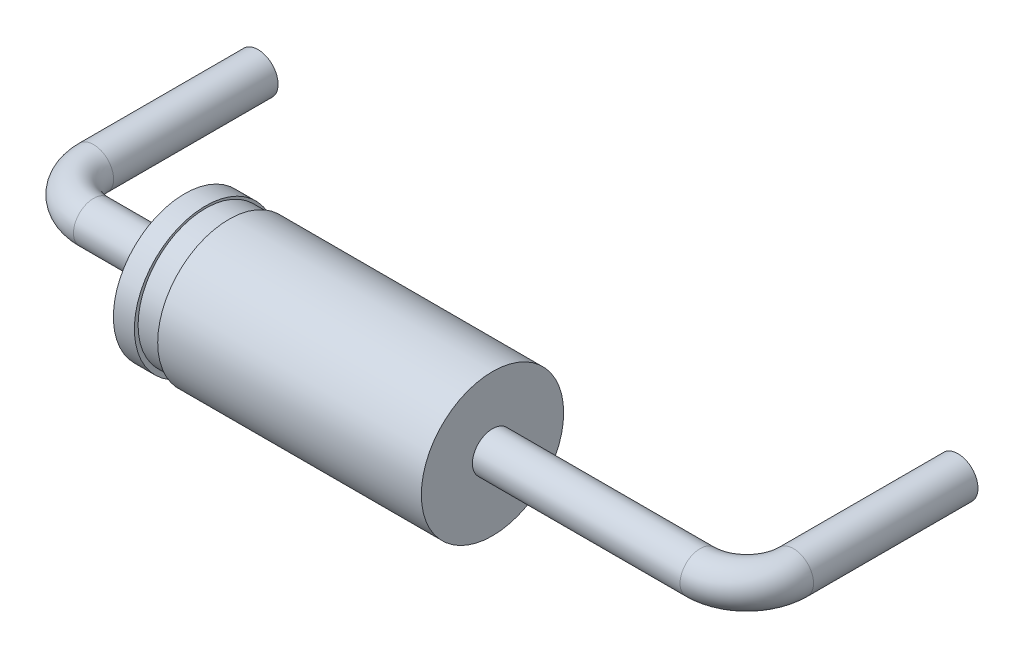
ISO-10303-21;
HEADER;
FILE_DESCRIPTION(('STEP AP214'),'2;1');
FILE_NAME('part.step','',(''),(''),'','','');
FILE_SCHEMA(('AUTOMOTIVE_DESIGN { 1 0 10303 214 1 1 1 1 }'));
ENDSEC;
DATA;
#1=APPLICATION_CONTEXT('core data for automotive mechanical design processes');
#2=APPLICATION_PROTOCOL_DEFINITION('international standard','automotive_design',2000,#1);
#3=PRODUCT_CONTEXT('',#1,'mechanical');
#4=PRODUCT('Part','Part','',(#3));
#5=PRODUCT_RELATED_PRODUCT_CATEGORY('part','',(#4));
#6=PRODUCT_DEFINITION_FORMATION('','',#4);
#7=PRODUCT_DEFINITION_CONTEXT('part definition',#1,'design');
#8=PRODUCT_DEFINITION('design','',#6,#7);
#9=PRODUCT_DEFINITION_SHAPE('','',#8);
#10=(LENGTH_UNIT() NAMED_UNIT(*) SI_UNIT(.MILLI.,.METRE.));
#11=(NAMED_UNIT(*) PLANE_ANGLE_UNIT() SI_UNIT($,.RADIAN.));
#12=(NAMED_UNIT(*) SI_UNIT($,.STERADIAN.) SOLID_ANGLE_UNIT());
#13=UNCERTAINTY_MEASURE_WITH_UNIT(LENGTH_MEASURE(1.E-05),#10,'distance_accuracy_value','');
#14=(GEOMETRIC_REPRESENTATION_CONTEXT(3) GLOBAL_UNCERTAINTY_ASSIGNED_CONTEXT((#13)) GLOBAL_UNIT_ASSIGNED_CONTEXT((#10,
#11,#12)) REPRESENTATION_CONTEXT('',''));
#15=CARTESIAN_POINT('',(0.,0.,0.));
#16=DIRECTION('',(0.,0.,1.));
#17=DIRECTION('',(1.,0.,0.));
#18=AXIS2_PLACEMENT_3D('',#15,#16,#17);
#19=CARTESIAN_POINT('',(1.,0.,1.525));
#20=DIRECTION('',(1.,0.,0.));
#21=DIRECTION('',(0.,0.,-1.));
#22=AXIS2_PLACEMENT_3D('',#19,#20,#21);
#23=CYLINDRICAL_SURFACE('',#22,0.43);
#24=CARTESIAN_POINT('',(1.,0.,1.525));
#25=DIRECTION('',(1.,0.,0.));
#26=DIRECTION('',(0.,0.,-1.));
#27=AXIS2_PLACEMENT_3D('',#24,#25,#26);
#28=CIRCLE('',#27,0.43);
#29=CARTESIAN_POINT('',(1.,0.,1.955));
#30=VERTEX_POINT('',#29);
#31=EDGE_CURVE('E49',#30,#30,#28,.T.);
#32=ORIENTED_EDGE('',*,*,#31,.T.);
#33=EDGE_LOOP('',(#32));
#34=FACE_BOUND('',#33,.T.);
#35=CARTESIAN_POINT('',(2.95,0.,1.525));
#36=DIRECTION('',(1.,0.,0.));
#37=DIRECTION('',(0.,0.,-1.));
#38=AXIS2_PLACEMENT_3D('',#35,#36,#37);
#39=CIRCLE('',#38,0.43);
#40=CARTESIAN_POINT('',(2.95,0.,1.095));
#41=VERTEX_POINT('',#40);
#42=EDGE_CURVE('E33',#41,#41,#39,.F.);
#43=ORIENTED_EDGE('',*,*,#42,.T.);
#44=EDGE_LOOP('',(#43));
#45=FACE_BOUND('',#44,.T.);
#46=ADVANCED_FACE('F29',(#34,#45),#23,.T.);
#47=CARTESIAN_POINT('',(1.,0.,0.525));
#48=DIRECTION('',(0.,1.,0.));
#49=DIRECTION('',(0.,0.,1.));
#50=AXIS2_PLACEMENT_3D('',#47,#48,#49);
#51=TOROIDAL_SURFACE('',#50,1.,0.43);
#52=CARTESIAN_POINT('',(0.,0.,0.525));
#53=DIRECTION('',(0.,0.,1.));
#54=DIRECTION('',(1.,0.,0.));
#55=AXIS2_PLACEMENT_3D('',#52,#53,#54);
#56=CIRCLE('',#55,0.43);
#57=CARTESIAN_POINT('',(-0.43,0.,0.525));
#58=VERTEX_POINT('',#57);
#59=EDGE_CURVE('E52',#58,#58,#56,.T.);
#60=CARTESIAN_POINT('',(1.,0.,0.525));
#61=DIRECTION('',(0.,1.,0.));
#62=DIRECTION('',(0.,0.,1.));
#63=AXIS2_PLACEMENT_3D('',#60,#61,#62);
#64=CIRCLE('',#63,1.43);
#65=EDGE_CURVE('',#58,#30,#64,.T.);
#66=ORIENTED_EDGE('',*,*,#59,.T.);
#67=ORIENTED_EDGE('',*,*,#31,.F.);
#68=ORIENTED_EDGE('',*,*,#65,.T.);
#69=ORIENTED_EDGE('',*,*,#65,.F.);
#70=EDGE_LOOP('',(#66,#68,#67,#69));
#71=FACE_BOUND('',#70,.T.);
#72=ADVANCED_FACE('F108',(#71),#51,.T.);
#73=CARTESIAN_POINT('',(0.,0.,0.525));
#74=DIRECTION('',(0.,0.,-1.));
#75=DIRECTION('',(-1.,0.,0.));
#76=AXIS2_PLACEMENT_3D('',#73,#74,#75);
#77=CYLINDRICAL_SURFACE('',#76,0.43);
#78=ORIENTED_EDGE('',*,*,#59,.F.);
#79=EDGE_LOOP('',(#78));
#80=FACE_BOUND('',#79,.T.);
#81=CARTESIAN_POINT('',(0.,0.,-3.));
#82=DIRECTION('',(0.,0.,1.));
#83=DIRECTION('',(1.,0.,0.));
#84=AXIS2_PLACEMENT_3D('',#81,#82,#83);
#85=CIRCLE('',#84,0.43);
#86=CARTESIAN_POINT('',(0.43,0.,-3.));
#87=VERTEX_POINT('',#86);
#88=EDGE_CURVE('E55',#87,#87,#85,.T.);
#89=ORIENTED_EDGE('',*,*,#88,.T.);
#90=EDGE_LOOP('',(#89));
#91=FACE_BOUND('',#90,.T.);
#92=ADVANCED_FACE('F115',(#80,#91),#77,.T.);
#93=CARTESIAN_POINT('',(0.,0.,-3.));
#94=DIRECTION('',(0.,0.,1.));
#95=DIRECTION('',(1.,0.,0.));
#96=AXIS2_PLACEMENT_3D('',#93,#94,#95);
#97=PLANE('',#96);
#98=ORIENTED_EDGE('',*,*,#88,.F.);
#99=EDGE_LOOP('',(#98));
#100=FACE_BOUND('',#99,.T.);
#101=ADVANCED_FACE('F105',(#100),#97,.F.);
#102=CARTESIAN_POINT('',(9.55,-0.0336492653327545,1.525));
#103=DIRECTION('',(-1.,0.,0.));
#104=DIRECTION('',(0.,0.,1.));
#105=AXIS2_PLACEMENT_3D('',#102,#103,#104);
#106=CYLINDRICAL_SURFACE('',#105,1.525);
#107=CARTESIAN_POINT('',(2.95,-0.0336492653327545,1.525));
#108=DIRECTION('',(1.,0.,0.));
#109=DIRECTION('',(0.,0.,-1.));
#110=AXIS2_PLACEMENT_3D('',#107,#108,#109);
#111=CIRCLE('',#110,1.525);
#112=CARTESIAN_POINT('',(2.95,-0.0336492653327545,0.));
#113=VERTEX_POINT('',#112);
#114=EDGE_CURVE('E61',#113,#113,#111,.T.);
#115=ORIENTED_EDGE('',*,*,#114,.T.);
#116=EDGE_LOOP('',(#115));
#117=FACE_BOUND('',#116,.T.);
#118=CARTESIAN_POINT('',(3.4,-0.0336492653327545,1.525));
#119=DIRECTION('',(1.,0.,0.));
#120=DIRECTION('',(0.,0.,-1.));
#121=AXIS2_PLACEMENT_3D('',#118,#119,#120);
#122=CIRCLE('',#121,1.525);
#123=CARTESIAN_POINT('',(3.4,-0.0336492653327545,0.));
#124=VERTEX_POINT('',#123);
#125=EDGE_CURVE('E58',#124,#124,#122,.T.);
#126=ORIENTED_EDGE('',*,*,#125,.F.);
#127=EDGE_LOOP('',(#126));
#128=FACE_BOUND('',#127,.T.);
#129=ADVANCED_FACE('F93',(#117,#128),#106,.T.);
#130=CARTESIAN_POINT('',(2.95,-0.0336492653327545,1.525));
#131=DIRECTION('',(1.,0.,0.));
#132=DIRECTION('',(0.,0.,-1.));
#133=AXIS2_PLACEMENT_3D('',#130,#131,#132);
#134=PLANE('',#133);
#135=ORIENTED_EDGE('',*,*,#42,.F.);
#136=EDGE_LOOP('',(#135));
#137=FACE_BOUND('',#136,.T.);
#138=ORIENTED_EDGE('',*,*,#114,.F.);
#139=EDGE_LOOP('',(#138));
#140=FACE_BOUND('',#139,.T.);
#141=ADVANCED_FACE('F104',(#137,#140),#134,.F.);
#142=CARTESIAN_POINT('',(3.4,0.,-0.22));
#143=DIRECTION('',(1.,0.,0.));
#144=DIRECTION('',(0.,0.,-1.));
#145=AXIS2_PLACEMENT_3D('',#142,#143,#144);
#146=PLANE('',#145);
#147=CARTESIAN_POINT('',(3.4,0.,1.525));
#148=DIRECTION('',(-1.,0.,0.));
#149=DIRECTION('',(0.,0.,1.));
#150=AXIS2_PLACEMENT_3D('',#147,#148,#149);
#151=CIRCLE('',#150,1.445);
#152=CARTESIAN_POINT('',(3.4,0.,2.97));
#153=VERTEX_POINT('',#152);
#154=EDGE_CURVE('E65',#153,#153,#151,.T.);
#155=ORIENTED_EDGE('',*,*,#154,.T.);
#156=EDGE_LOOP('',(#155));
#157=FACE_BOUND('',#156,.T.);
#158=ORIENTED_EDGE('',*,*,#125,.T.);
#159=EDGE_LOOP('',(#158));
#160=FACE_BOUND('',#159,.T.);
#161=ADVANCED_FACE('F83',(#157,#160),#146,.T.);
#162=CARTESIAN_POINT('',(3.9,0.,-0.22));
#163=DIRECTION('',(-1.,0.,0.));
#164=DIRECTION('',(0.,0.,1.));
#165=AXIS2_PLACEMENT_3D('',#162,#163,#164);
#166=PLANE('',#165);
#167=CARTESIAN_POINT('',(3.9,0.,1.525));
#168=DIRECTION('',(-1.,0.,0.));
#169=DIRECTION('',(0.,0.,1.));
#170=AXIS2_PLACEMENT_3D('',#167,#168,#169);
#171=CIRCLE('',#170,1.445);
#172=CARTESIAN_POINT('',(3.9,0.,2.97));
#173=VERTEX_POINT('',#172);
#174=EDGE_CURVE('E73',#173,#173,#171,.T.);
#175=ORIENTED_EDGE('',*,*,#174,.F.);
#176=EDGE_LOOP('',(#175));
#177=FACE_BOUND('',#176,.T.);
#178=CARTESIAN_POINT('',(3.9,-0.0336492653327545,1.525));
#179=DIRECTION('',(-1.,0.,0.));
#180=DIRECTION('',(0.,0.,1.));
#181=AXIS2_PLACEMENT_3D('',#178,#179,#180);
#182=CIRCLE('',#181,1.525);
#183=CARTESIAN_POINT('',(3.9,-0.0336492653327545,3.05));
#184=VERTEX_POINT('',#183);
#185=EDGE_CURVE('E62',#184,#184,#182,.T.);
#186=ORIENTED_EDGE('',*,*,#185,.T.);
#187=EDGE_LOOP('',(#186));
#188=FACE_BOUND('',#187,.T.);
#189=ADVANCED_FACE('F80',(#177,#188),#166,.T.);
#190=CARTESIAN_POINT('',(0.,0.,1.525));
#191=DIRECTION('',(-1.,0.,0.));
#192=DIRECTION('',(0.,0.,1.));
#193=AXIS2_PLACEMENT_3D('',#190,#191,#192);
#194=CYLINDRICAL_SURFACE('',#193,1.445);
#195=ORIENTED_EDGE('',*,*,#174,.T.);
#196=EDGE_LOOP('',(#195));
#197=FACE_BOUND('',#196,.T.);
#198=ORIENTED_EDGE('',*,*,#154,.F.);
#199=EDGE_LOOP('',(#198));
#200=FACE_BOUND('',#199,.T.);
#201=ADVANCED_FACE('F77',(#197,#200),#194,.T.);
#202=CARTESIAN_POINT('',(9.55,-0.0336492653327545,1.525));
#203=DIRECTION('',(1.,0.,0.));
#204=DIRECTION('',(0.,0.,-1.));
#205=AXIS2_PLACEMENT_3D('',#202,#203,#204);
#206=PLANE('',#205);
#207=CARTESIAN_POINT('',(9.55,0.,1.525));
#208=DIRECTION('',(1.,0.,0.));
#209=DIRECTION('',(0.,0.,-1.));
#210=AXIS2_PLACEMENT_3D('',#207,#208,#209);
#211=CIRCLE('',#210,0.43);
#212=CARTESIAN_POINT('',(9.55,0.,1.095));
#213=VERTEX_POINT('',#212);
#214=EDGE_CURVE('E10',#213,#213,#211,.F.);
#215=ORIENTED_EDGE('',*,*,#214,.T.);
#216=EDGE_LOOP('',(#215));
#217=FACE_BOUND('',#216,.T.);
#218=CARTESIAN_POINT('',(9.55,-0.0336492653327545,1.525));
#219=DIRECTION('',(1.,0.,0.));
#220=DIRECTION('',(0.,0.,-1.));
#221=AXIS2_PLACEMENT_3D('',#218,#219,#220);
#222=CIRCLE('',#221,1.525);
#223=CARTESIAN_POINT('',(9.55,-0.0336492653327545,0.));
#224=VERTEX_POINT('',#223);
#225=EDGE_CURVE('E68',#224,#224,#222,.T.);
#226=ORIENTED_EDGE('',*,*,#225,.T.);
#227=EDGE_LOOP('',(#226));
#228=FACE_BOUND('',#227,.T.);
#229=ADVANCED_FACE('F90',(#217,#228),#206,.T.);
#230=ORIENTED_EDGE('',*,*,#225,.F.);
#231=EDGE_LOOP('',(#230));
#232=FACE_BOUND('',#231,.T.);
#233=ORIENTED_EDGE('',*,*,#185,.F.);
#234=EDGE_LOOP('',(#233));
#235=FACE_BOUND('',#234,.T.);
#236=ADVANCED_FACE('F87',(#232,#235),#106,.T.);
#237=CARTESIAN_POINT('',(15.,0.,-3.));
#238=DIRECTION('',(0.,0.,-1.));
#239=DIRECTION('',(-1.,0.,0.));
#240=AXIS2_PLACEMENT_3D('',#237,#238,#239);
#241=PLANE('',#240);
#242=CARTESIAN_POINT('',(15.,0.,-3.));
#243=DIRECTION('',(0.,0.,1.));
#244=DIRECTION('',(-1.,0.,0.));
#245=AXIS2_PLACEMENT_3D('',#242,#243,#244);
#246=CIRCLE('',#245,0.43);
#247=CARTESIAN_POINT('',(14.57,0.,-3.));
#248=VERTEX_POINT('',#247);
#249=EDGE_CURVE('E37',#248,#248,#246,.T.);
#250=ORIENTED_EDGE('',*,*,#249,.F.);
#251=EDGE_LOOP('',(#250));
#252=FACE_BOUND('',#251,.T.);
#253=ADVANCED_FACE('F89',(#252),#241,.T.);
#254=CARTESIAN_POINT('',(15.,0.,-3.));
#255=DIRECTION('',(0.,0.,1.));
#256=DIRECTION('',(1.,0.,0.));
#257=AXIS2_PLACEMENT_3D('',#254,#255,#256);
#258=CYLINDRICAL_SURFACE('',#257,0.43);
#259=ORIENTED_EDGE('',*,*,#249,.T.);
#260=EDGE_LOOP('',(#259));
#261=FACE_BOUND('',#260,.T.);
#262=CARTESIAN_POINT('',(15.,0.,0.524999999999999));
#263=DIRECTION('',(0.,0.,-1.));
#264=DIRECTION('',(-1.,0.,0.));
#265=AXIS2_PLACEMENT_3D('',#262,#263,#264);
#266=CIRCLE('',#265,0.43);
#267=CARTESIAN_POINT('',(15.43,0.,0.524999999999999));
#268=VERTEX_POINT('',#267);
#269=EDGE_CURVE('E41',#268,#268,#266,.T.);
#270=ORIENTED_EDGE('',*,*,#269,.T.);
#271=EDGE_LOOP('',(#270));
#272=FACE_BOUND('',#271,.T.);
#273=ADVANCED_FACE('F31',(#261,#272),#258,.T.);
#274=CARTESIAN_POINT('',(14.,0.,0.525));
#275=DIRECTION('',(0.,1.,0.));
#276=DIRECTION('',(0.,0.,1.));
#277=AXIS2_PLACEMENT_3D('',#274,#275,#276);
#278=TOROIDAL_SURFACE('',#277,1.,0.43);
#279=CARTESIAN_POINT('',(14.,0.,1.525));
#280=DIRECTION('',(1.,0.,0.));
#281=DIRECTION('',(0.,0.,-1.));
#282=AXIS2_PLACEMENT_3D('',#279,#280,#281);
#283=CIRCLE('',#282,0.43);
#284=CARTESIAN_POINT('',(14.,0.,1.955));
#285=VERTEX_POINT('',#284);
#286=EDGE_CURVE('E46',#285,#285,#283,.T.);
#287=CARTESIAN_POINT('',(14.,0.,0.525));
#288=DIRECTION('',(0.,1.,0.));
#289=DIRECTION('',(0.,0.,1.));
#290=AXIS2_PLACEMENT_3D('',#287,#288,#289);
#291=CIRCLE('',#290,1.43);
#292=EDGE_CURVE('',#285,#268,#291,.T.);
#293=ORIENTED_EDGE('',*,*,#286,.T.);
#294=ORIENTED_EDGE('',*,*,#269,.F.);
#295=ORIENTED_EDGE('',*,*,#292,.T.);
#296=ORIENTED_EDGE('',*,*,#292,.F.);
#297=EDGE_LOOP('',(#293,#295,#294,#296));
#298=FACE_BOUND('',#297,.T.);
#299=ADVANCED_FACE('F121',(#298),#278,.T.);
#300=ORIENTED_EDGE('',*,*,#214,.F.);
#301=EDGE_LOOP('',(#300));
#302=FACE_BOUND('',#301,.T.);
#303=ORIENTED_EDGE('',*,*,#286,.F.);
#304=EDGE_LOOP('',(#303));
#305=FACE_BOUND('',#304,.T.);
#306=ADVANCED_FACE('F111',(#302,#305),#23,.T.);
#307=CLOSED_SHELL('',(#46,#72,#92,#101,#129,#141,#161,#189,#201,#229,#236,#253,#273,#299,#306));
#308=MANIFOLD_SOLID_BREP('B2',#307);
#309=ADVANCED_BREP_SHAPE_REPRESENTATION('',(#18,#308),#14);
#310=SHAPE_DEFINITION_REPRESENTATION(#9,#309);
ENDSEC;
END-ISO-10303-21;
